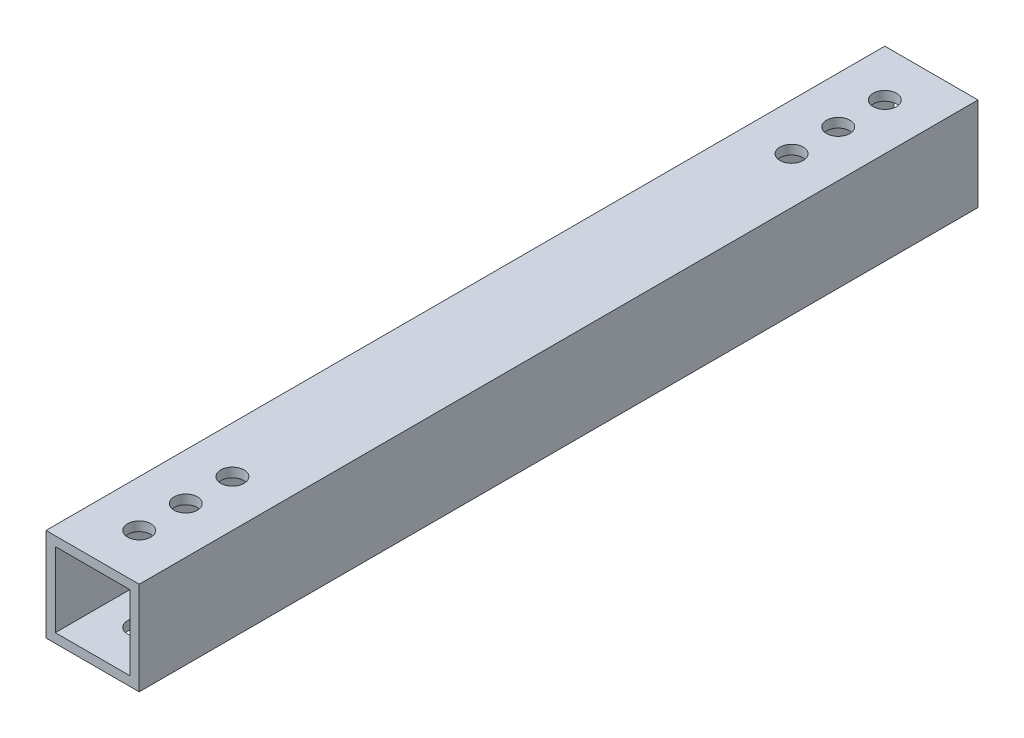
ISO-10303-21;
HEADER;
FILE_DESCRIPTION(('STEP AP214'),'2;1');
FILE_NAME('part.step','',(''),(''),'','','');
FILE_SCHEMA(('AUTOMOTIVE_DESIGN { 1 0 10303 214 1 1 1 1 }'));
ENDSEC;
DATA;
#1=APPLICATION_CONTEXT('core data for automotive mechanical design processes');
#2=APPLICATION_PROTOCOL_DEFINITION('international standard','automotive_design',2000,#1);
#3=PRODUCT_CONTEXT('',#1,'mechanical');
#4=PRODUCT('Part','Part','',(#3));
#5=PRODUCT_RELATED_PRODUCT_CATEGORY('part','',(#4));
#6=PRODUCT_DEFINITION_FORMATION('','',#4);
#7=PRODUCT_DEFINITION_CONTEXT('part definition',#1,'design');
#8=PRODUCT_DEFINITION('design','',#6,#7);
#9=PRODUCT_DEFINITION_SHAPE('','',#8);
#10=(LENGTH_UNIT() NAMED_UNIT(*) SI_UNIT(.MILLI.,.METRE.));
#11=(NAMED_UNIT(*) PLANE_ANGLE_UNIT() SI_UNIT($,.RADIAN.));
#12=(NAMED_UNIT(*) SI_UNIT($,.STERADIAN.) SOLID_ANGLE_UNIT());
#13=UNCERTAINTY_MEASURE_WITH_UNIT(LENGTH_MEASURE(1.E-05),#10,'distance_accuracy_value','');
#14=(GEOMETRIC_REPRESENTATION_CONTEXT(3) GLOBAL_UNCERTAINTY_ASSIGNED_CONTEXT((#13)) GLOBAL_UNIT_ASSIGNED_CONTEXT((#10,
#11,#12)) REPRESENTATION_CONTEXT('',''));
#15=CARTESIAN_POINT('',(0.,0.,0.));
#16=DIRECTION('',(0.,0.,1.));
#17=DIRECTION('',(1.,0.,0.));
#18=AXIS2_PLACEMENT_3D('',#15,#16,#17);
#19=CARTESIAN_POINT('',(0.,0.,228.6));
#20=DIRECTION('',(0.,0.,-1.));
#21=DIRECTION('',(-1.,0.,0.));
#22=AXIS2_PLACEMENT_3D('',#19,#20,#21);
#23=PLANE('',#22);
#24=DIRECTION('',(0.,1.,0.));
#25=VECTOR('',#24,1.);
#26=CARTESIAN_POINT('',(12.7,-12.7,228.6));
#27=LINE('',#26,#25);
#28=CARTESIAN_POINT('',(12.7,-12.7,228.6));
#29=VERTEX_POINT('',#28);
#30=CARTESIAN_POINT('',(12.7,12.7,228.6));
#31=VERTEX_POINT('',#30);
#32=EDGE_CURVE('E138',#29,#31,#27,.T.);
#33=ORIENTED_EDGE('',*,*,#32,.T.);
#34=DIRECTION('',(-1.,0.,0.));
#35=VECTOR('',#34,1.);
#36=CARTESIAN_POINT('',(-12.7,12.7,228.6));
#37=LINE('',#36,#35);
#38=CARTESIAN_POINT('',(-12.7,12.7,228.6));
#39=VERTEX_POINT('',#38);
#40=EDGE_CURVE('E141',#31,#39,#37,.T.);
#41=ORIENTED_EDGE('',*,*,#40,.T.);
#42=DIRECTION('',(0.,-1.,0.));
#43=VECTOR('',#42,1.);
#44=CARTESIAN_POINT('',(-12.7,-12.7,228.6));
#45=LINE('',#44,#43);
#46=CARTESIAN_POINT('',(-12.7,-12.7,228.6));
#47=VERTEX_POINT('',#46);
#48=EDGE_CURVE('E144',#39,#47,#45,.T.);
#49=ORIENTED_EDGE('',*,*,#48,.T.);
#50=DIRECTION('',(1.,0.,0.));
#51=VECTOR('',#50,1.);
#52=CARTESIAN_POINT('',(-12.7,-12.7,228.6));
#53=LINE('',#52,#51);
#54=EDGE_CURVE('E146',#47,#29,#53,.T.);
#55=ORIENTED_EDGE('',*,*,#54,.T.);
#56=EDGE_LOOP('',(#33,#41,#49,#55));
#57=FACE_BOUND('',#56,.T.);
#58=DIRECTION('',(0.,-1.,0.));
#59=VECTOR('',#58,1.);
#60=CARTESIAN_POINT('',(-10.16,-10.16,228.6));
#61=LINE('',#60,#59);
#62=CARTESIAN_POINT('',(-10.16,10.16,228.6));
#63=VERTEX_POINT('',#62);
#64=CARTESIAN_POINT('',(-10.16,-10.16,228.6));
#65=VERTEX_POINT('',#64);
#66=EDGE_CURVE('E100',#63,#65,#61,.T.);
#67=ORIENTED_EDGE('',*,*,#66,.F.);
#68=DIRECTION('',(-1.,0.,0.));
#69=VECTOR('',#68,1.);
#70=CARTESIAN_POINT('',(-10.16,10.16,228.6));
#71=LINE('',#70,#69);
#72=CARTESIAN_POINT('',(10.16,10.16,228.6));
#73=VERTEX_POINT('',#72);
#74=EDGE_CURVE('E122',#73,#63,#71,.T.);
#75=ORIENTED_EDGE('',*,*,#74,.F.);
#76=DIRECTION('',(0.,1.,0.));
#77=VECTOR('',#76,1.);
#78=CARTESIAN_POINT('',(10.16,-10.16,228.6));
#79=LINE('',#78,#77);
#80=CARTESIAN_POINT('',(10.16,-10.16,228.6));
#81=VERTEX_POINT('',#80);
#82=EDGE_CURVE('E120',#81,#73,#79,.T.);
#83=ORIENTED_EDGE('',*,*,#82,.F.);
#84=DIRECTION('',(1.,0.,0.));
#85=VECTOR('',#84,1.);
#86=CARTESIAN_POINT('',(-10.16,-10.16,228.6));
#87=LINE('',#86,#85);
#88=EDGE_CURVE('E108',#65,#81,#87,.T.);
#89=ORIENTED_EDGE('',*,*,#88,.F.);
#90=EDGE_LOOP('',(#67,#75,#83,#89));
#91=FACE_BOUND('',#90,.T.);
#92=ADVANCED_FACE('F33',(#57,#91),#23,.F.);
#93=CARTESIAN_POINT('',(0.,0.,0.));
#94=DIRECTION('',(0.,0.,-1.));
#95=DIRECTION('',(-1.,0.,0.));
#96=AXIS2_PLACEMENT_3D('',#93,#94,#95);
#97=PLANE('',#96);
#98=DIRECTION('',(0.,1.,0.));
#99=VECTOR('',#98,1.);
#100=CARTESIAN_POINT('',(12.7,-12.7,0.));
#101=LINE('',#100,#99);
#102=CARTESIAN_POINT('',(12.7,-12.7,0.));
#103=VERTEX_POINT('',#102);
#104=CARTESIAN_POINT('',(12.7,12.7,0.));
#105=VERTEX_POINT('',#104);
#106=EDGE_CURVE('E116',#103,#105,#101,.T.);
#107=ORIENTED_EDGE('',*,*,#106,.F.);
#108=DIRECTION('',(1.,0.,0.));
#109=VECTOR('',#108,1.);
#110=CARTESIAN_POINT('',(-12.7,-12.7,0.));
#111=LINE('',#110,#109);
#112=CARTESIAN_POINT('',(-12.7,-12.7,0.));
#113=VERTEX_POINT('',#112);
#114=EDGE_CURVE('E142',#113,#103,#111,.T.);
#115=ORIENTED_EDGE('',*,*,#114,.F.);
#116=DIRECTION('',(0.,-1.,0.));
#117=VECTOR('',#116,1.);
#118=CARTESIAN_POINT('',(-12.7,-12.7,0.));
#119=LINE('',#118,#117);
#120=CARTESIAN_POINT('',(-12.7,12.7,0.));
#121=VERTEX_POINT('',#120);
#122=EDGE_CURVE('E153',#121,#113,#119,.T.);
#123=ORIENTED_EDGE('',*,*,#122,.F.);
#124=DIRECTION('',(-1.,0.,0.));
#125=VECTOR('',#124,1.);
#126=CARTESIAN_POINT('',(-12.7,12.7,0.));
#127=LINE('',#126,#125);
#128=EDGE_CURVE('E151',#105,#121,#127,.T.);
#129=ORIENTED_EDGE('',*,*,#128,.F.);
#130=EDGE_LOOP('',(#107,#115,#123,#129));
#131=FACE_BOUND('',#130,.T.);
#132=DIRECTION('',(-1.,0.,0.));
#133=VECTOR('',#132,1.);
#134=CARTESIAN_POINT('',(-10.16,10.16,0.));
#135=LINE('',#134,#133);
#136=CARTESIAN_POINT('',(10.16,10.16,0.));
#137=VERTEX_POINT('',#136);
#138=CARTESIAN_POINT('',(-10.16,10.16,0.));
#139=VERTEX_POINT('',#138);
#140=EDGE_CURVE('E109',#137,#139,#135,.T.);
#141=ORIENTED_EDGE('',*,*,#140,.T.);
#142=DIRECTION('',(0.,-1.,0.));
#143=VECTOR('',#142,1.);
#144=CARTESIAN_POINT('',(-10.16,-10.16,0.));
#145=LINE('',#144,#143);
#146=CARTESIAN_POINT('',(-10.16,-10.16,0.));
#147=VERTEX_POINT('',#146);
#148=EDGE_CURVE('E58',#139,#147,#145,.T.);
#149=ORIENTED_EDGE('',*,*,#148,.T.);
#150=DIRECTION('',(1.,0.,0.));
#151=VECTOR('',#150,1.);
#152=CARTESIAN_POINT('',(-10.16,-10.16,0.));
#153=LINE('',#152,#151);
#154=CARTESIAN_POINT('',(10.16,-10.16,0.));
#155=VERTEX_POINT('',#154);
#156=EDGE_CURVE('E115',#147,#155,#153,.T.);
#157=ORIENTED_EDGE('',*,*,#156,.T.);
#158=DIRECTION('',(0.,1.,0.));
#159=VECTOR('',#158,1.);
#160=CARTESIAN_POINT('',(10.16,-10.16,0.));
#161=LINE('',#160,#159);
#162=EDGE_CURVE('E130',#155,#137,#161,.T.);
#163=ORIENTED_EDGE('',*,*,#162,.T.);
#164=EDGE_LOOP('',(#141,#149,#157,#163));
#165=FACE_BOUND('',#164,.T.);
#166=ADVANCED_FACE('F249',(#131,#165),#97,.T.);
#167=CARTESIAN_POINT('',(12.7,-12.7,228.6));
#168=DIRECTION('',(-1.,0.,0.));
#169=DIRECTION('',(0.,0.,1.));
#170=AXIS2_PLACEMENT_3D('',#167,#168,#169);
#171=PLANE('',#170);
#172=ORIENTED_EDGE('',*,*,#106,.T.);
#173=DIRECTION('',(0.,0.,-1.));
#174=VECTOR('',#173,1.);
#175=CARTESIAN_POINT('',(12.7,12.7,228.6));
#176=LINE('',#175,#174);
#177=EDGE_CURVE('E11',#31,#105,#176,.T.);
#178=ORIENTED_EDGE('',*,*,#177,.F.);
#179=ORIENTED_EDGE('',*,*,#32,.F.);
#180=DIRECTION('',(0.,0.,-1.));
#181=VECTOR('',#180,1.);
#182=CARTESIAN_POINT('',(12.7,-12.7,228.6));
#183=LINE('',#182,#181);
#184=EDGE_CURVE('E148',#29,#103,#183,.T.);
#185=ORIENTED_EDGE('',*,*,#184,.T.);
#186=EDGE_LOOP('',(#172,#178,#179,#185));
#187=FACE_BOUND('',#186,.T.);
#188=ADVANCED_FACE('F35',(#187),#171,.F.);
#189=CARTESIAN_POINT('',(-12.7,12.7,228.6));
#190=DIRECTION('',(0.,-1.,0.));
#191=DIRECTION('',(0.,0.,-1.));
#192=AXIS2_PLACEMENT_3D('',#189,#190,#191);
#193=PLANE('',#192);
#194=CARTESIAN_POINT('',(0.,12.7,215.9));
#195=DIRECTION('',(0.,1.,0.));
#196=DIRECTION('',(0.,0.,-1.));
#197=AXIS2_PLACEMENT_3D('',#194,#195,#196);
#198=CIRCLE('',#197,3.175);
#199=CARTESIAN_POINT('',(0.,12.7,212.725));
#200=VERTEX_POINT('',#199);
#201=EDGE_CURVE('E274',#200,#200,#198,.T.);
#202=ORIENTED_EDGE('',*,*,#201,.F.);
#203=EDGE_LOOP('',(#202));
#204=FACE_BOUND('',#203,.T.);
#205=CARTESIAN_POINT('',(1.79700204165607E-13,12.7,203.2));
#206=DIRECTION('',(0.,1.,0.));
#207=DIRECTION('',(0.,0.,-1.));
#208=AXIS2_PLACEMENT_3D('',#205,#206,#207);
#209=CIRCLE('',#208,3.175);
#210=CARTESIAN_POINT('',(1.79700204165607E-13,12.7,200.025));
#211=VERTEX_POINT('',#210);
#212=EDGE_CURVE('E191',#211,#211,#209,.T.);
#213=ORIENTED_EDGE('',*,*,#212,.F.);
#214=EDGE_LOOP('',(#213));
#215=FACE_BOUND('',#214,.T.);
#216=CARTESIAN_POINT('',(3.57845106896297E-13,12.7,190.5));
#217=DIRECTION('',(0.,1.,0.));
#218=DIRECTION('',(0.,0.,-1.));
#219=AXIS2_PLACEMENT_3D('',#216,#217,#218);
#220=CIRCLE('',#219,3.175);
#221=CARTESIAN_POINT('',(3.57845106896297E-13,12.7,187.325));
#222=VERTEX_POINT('',#221);
#223=EDGE_CURVE('E188',#222,#222,#220,.T.);
#224=ORIENTED_EDGE('',*,*,#223,.F.);
#225=EDGE_LOOP('',(#224));
#226=FACE_BOUND('',#225,.T.);
#227=CARTESIAN_POINT('',(3.57845106896297E-13,12.7,38.1));
#228=DIRECTION('',(0.,1.,0.));
#229=DIRECTION('',(0.,0.,1.));
#230=AXIS2_PLACEMENT_3D('',#227,#228,#229);
#231=CIRCLE('',#230,3.175);
#232=CARTESIAN_POINT('',(3.57845106896297E-13,12.7,41.275));
#233=VERTEX_POINT('',#232);
#234=EDGE_CURVE('E207',#233,#233,#231,.T.);
#235=ORIENTED_EDGE('',*,*,#234,.F.);
#236=EDGE_LOOP('',(#235));
#237=FACE_BOUND('',#236,.T.);
#238=CARTESIAN_POINT('',(1.79700204165607E-13,12.7,25.4));
#239=DIRECTION('',(0.,1.,0.));
#240=DIRECTION('',(0.,0.,1.));
#241=AXIS2_PLACEMENT_3D('',#238,#239,#240);
#242=CIRCLE('',#241,3.175);
#243=CARTESIAN_POINT('',(1.79700204165607E-13,12.7,28.575));
#244=VERTEX_POINT('',#243);
#245=EDGE_CURVE('E214',#244,#244,#242,.T.);
#246=ORIENTED_EDGE('',*,*,#245,.F.);
#247=EDGE_LOOP('',(#246));
#248=FACE_BOUND('',#247,.T.);
#249=CARTESIAN_POINT('',(0.,12.7,12.7));
#250=DIRECTION('',(0.,1.,0.));
#251=DIRECTION('',(0.,0.,1.));
#252=AXIS2_PLACEMENT_3D('',#249,#250,#251);
#253=CIRCLE('',#252,3.175);
#254=CARTESIAN_POINT('',(0.,12.7,15.875));
#255=VERTEX_POINT('',#254);
#256=EDGE_CURVE('E221',#255,#255,#253,.T.);
#257=ORIENTED_EDGE('',*,*,#256,.F.);
#258=EDGE_LOOP('',(#257));
#259=FACE_BOUND('',#258,.T.);
#260=ORIENTED_EDGE('',*,*,#128,.T.);
#261=DIRECTION('',(0.,0.,-1.));
#262=VECTOR('',#261,1.);
#263=CARTESIAN_POINT('',(-12.7,12.7,228.6));
#264=LINE('',#263,#262);
#265=EDGE_CURVE('E42',#39,#121,#264,.T.);
#266=ORIENTED_EDGE('',*,*,#265,.F.);
#267=ORIENTED_EDGE('',*,*,#40,.F.);
#268=ORIENTED_EDGE('',*,*,#177,.T.);
#269=EDGE_LOOP('',(#260,#266,#267,#268));
#270=FACE_BOUND('',#269,.T.);
#271=ADVANCED_FACE('F262',(#204,#215,#226,#237,#248,#259,#270),#193,.F.);
#272=CARTESIAN_POINT('',(-12.7,-12.7,228.6));
#273=DIRECTION('',(1.,0.,0.));
#274=DIRECTION('',(0.,0.,-1.));
#275=AXIS2_PLACEMENT_3D('',#272,#273,#274);
#276=PLANE('',#275);
#277=ORIENTED_EDGE('',*,*,#122,.T.);
#278=DIRECTION('',(0.,0.,-1.));
#279=VECTOR('',#278,1.);
#280=CARTESIAN_POINT('',(-12.7,-12.7,228.6));
#281=LINE('',#280,#279);
#282=EDGE_CURVE('E158',#47,#113,#281,.T.);
#283=ORIENTED_EDGE('',*,*,#282,.F.);
#284=ORIENTED_EDGE('',*,*,#48,.F.);
#285=ORIENTED_EDGE('',*,*,#265,.T.);
#286=EDGE_LOOP('',(#277,#283,#284,#285));
#287=FACE_BOUND('',#286,.T.);
#288=ADVANCED_FACE('F259',(#287),#276,.F.);
#289=CARTESIAN_POINT('',(-12.7,-12.7,228.6));
#290=DIRECTION('',(0.,1.,0.));
#291=DIRECTION('',(0.,0.,1.));
#292=AXIS2_PLACEMENT_3D('',#289,#290,#291);
#293=PLANE('',#292);
#294=CARTESIAN_POINT('',(0.,-12.7,215.9));
#295=DIRECTION('',(0.,1.,0.));
#296=DIRECTION('',(0.,0.,-1.));
#297=AXIS2_PLACEMENT_3D('',#294,#295,#296);
#298=CIRCLE('',#297,3.175);
#299=CARTESIAN_POINT('',(0.,-12.7,212.725));
#300=VERTEX_POINT('',#299);
#301=EDGE_CURVE('E341',#300,#300,#298,.T.);
#302=ORIENTED_EDGE('',*,*,#301,.T.);
#303=EDGE_LOOP('',(#302));
#304=FACE_BOUND('',#303,.T.);
#305=CARTESIAN_POINT('',(1.79700204165607E-13,-12.7,203.2));
#306=DIRECTION('',(0.,1.,0.));
#307=DIRECTION('',(0.,0.,-1.));
#308=AXIS2_PLACEMENT_3D('',#305,#306,#307);
#309=CIRCLE('',#308,3.175);
#310=CARTESIAN_POINT('',(1.79700204165607E-13,-12.7,200.025));
#311=VERTEX_POINT('',#310);
#312=EDGE_CURVE('E184',#311,#311,#309,.T.);
#313=ORIENTED_EDGE('',*,*,#312,.T.);
#314=EDGE_LOOP('',(#313));
#315=FACE_BOUND('',#314,.T.);
#316=CARTESIAN_POINT('',(3.57845106896297E-13,-12.7,190.5));
#317=DIRECTION('',(0.,1.,0.));
#318=DIRECTION('',(0.,0.,-1.));
#319=AXIS2_PLACEMENT_3D('',#316,#317,#318);
#320=CIRCLE('',#319,3.175);
#321=CARTESIAN_POINT('',(3.57845106896297E-13,-12.7,187.325));
#322=VERTEX_POINT('',#321);
#323=EDGE_CURVE('E180',#322,#322,#320,.T.);
#324=ORIENTED_EDGE('',*,*,#323,.T.);
#325=EDGE_LOOP('',(#324));
#326=FACE_BOUND('',#325,.T.);
#327=CARTESIAN_POINT('',(3.57845106896297E-13,-12.7,38.1));
#328=DIRECTION('',(0.,1.,0.));
#329=DIRECTION('',(0.,0.,1.));
#330=AXIS2_PLACEMENT_3D('',#327,#328,#329);
#331=CIRCLE('',#330,3.175);
#332=CARTESIAN_POINT('',(3.57845106896297E-13,-12.7,41.275));
#333=VERTEX_POINT('',#332);
#334=EDGE_CURVE('E176',#333,#333,#331,.T.);
#335=ORIENTED_EDGE('',*,*,#334,.T.);
#336=EDGE_LOOP('',(#335));
#337=FACE_BOUND('',#336,.T.);
#338=CARTESIAN_POINT('',(1.79700204165607E-13,-12.7,25.4));
#339=DIRECTION('',(0.,1.,0.));
#340=DIRECTION('',(0.,0.,1.));
#341=AXIS2_PLACEMENT_3D('',#338,#339,#340);
#342=CIRCLE('',#341,3.175);
#343=CARTESIAN_POINT('',(1.79700204165607E-13,-12.7,28.575));
#344=VERTEX_POINT('',#343);
#345=EDGE_CURVE('E171',#344,#344,#342,.T.);
#346=ORIENTED_EDGE('',*,*,#345,.T.);
#347=EDGE_LOOP('',(#346));
#348=FACE_BOUND('',#347,.T.);
#349=CARTESIAN_POINT('',(0.,-12.7,12.7));
#350=DIRECTION('',(0.,1.,0.));
#351=DIRECTION('',(0.,0.,1.));
#352=AXIS2_PLACEMENT_3D('',#349,#350,#351);
#353=CIRCLE('',#352,3.175);
#354=CARTESIAN_POINT('',(0.,-12.7,15.875));
#355=VERTEX_POINT('',#354);
#356=EDGE_CURVE('E166',#355,#355,#353,.T.);
#357=ORIENTED_EDGE('',*,*,#356,.T.);
#358=EDGE_LOOP('',(#357));
#359=FACE_BOUND('',#358,.T.);
#360=ORIENTED_EDGE('',*,*,#114,.T.);
#361=ORIENTED_EDGE('',*,*,#184,.F.);
#362=ORIENTED_EDGE('',*,*,#54,.F.);
#363=ORIENTED_EDGE('',*,*,#282,.T.);
#364=EDGE_LOOP('',(#360,#361,#362,#363));
#365=FACE_BOUND('',#364,.T.);
#366=ADVANCED_FACE('F244',(#304,#315,#326,#337,#348,#359,#365),#293,.F.);
#367=CARTESIAN_POINT('',(-10.16,-10.16,228.6));
#368=DIRECTION('',(1.,0.,0.));
#369=DIRECTION('',(0.,0.,-1.));
#370=AXIS2_PLACEMENT_3D('',#367,#368,#369);
#371=PLANE('',#370);
#372=ORIENTED_EDGE('',*,*,#148,.F.);
#373=DIRECTION('',(0.,0.,-1.));
#374=VECTOR('',#373,1.);
#375=CARTESIAN_POINT('',(-10.16,10.16,228.6));
#376=LINE('',#375,#374);
#377=EDGE_CURVE('E104',#63,#139,#376,.T.);
#378=ORIENTED_EDGE('',*,*,#377,.F.);
#379=ORIENTED_EDGE('',*,*,#66,.T.);
#380=DIRECTION('',(0.,0.,-1.));
#381=VECTOR('',#380,1.);
#382=CARTESIAN_POINT('',(-10.16,-10.16,228.6));
#383=LINE('',#382,#381);
#384=EDGE_CURVE('E103',#65,#147,#383,.T.);
#385=ORIENTED_EDGE('',*,*,#384,.T.);
#386=EDGE_LOOP('',(#372,#378,#379,#385));
#387=FACE_BOUND('',#386,.T.);
#388=ADVANCED_FACE('F102',(#387),#371,.T.);
#389=CARTESIAN_POINT('',(-10.16,-10.16,228.6));
#390=DIRECTION('',(0.,1.,0.));
#391=DIRECTION('',(0.,0.,1.));
#392=AXIS2_PLACEMENT_3D('',#389,#390,#391);
#393=PLANE('',#392);
#394=CARTESIAN_POINT('',(0.,-10.16,215.9));
#395=DIRECTION('',(0.,1.,0.));
#396=DIRECTION('',(0.,0.,1.));
#397=AXIS2_PLACEMENT_3D('',#394,#395,#396);
#398=CIRCLE('',#397,3.175);
#399=CARTESIAN_POINT('',(0.,-10.16,219.075));
#400=VERTEX_POINT('',#399);
#401=EDGE_CURVE('E196',#400,#400,#398,.T.);
#402=ORIENTED_EDGE('',*,*,#401,.F.);
#403=EDGE_LOOP('',(#402));
#404=FACE_BOUND('',#403,.T.);
#405=CARTESIAN_POINT('',(1.79700204165607E-13,-10.16,203.2));
#406=DIRECTION('',(0.,1.,0.));
#407=DIRECTION('',(0.,0.,1.));
#408=AXIS2_PLACEMENT_3D('',#405,#406,#407);
#409=CIRCLE('',#408,3.175);
#410=CARTESIAN_POINT('',(1.79700204165607E-13,-10.16,206.375));
#411=VERTEX_POINT('',#410);
#412=EDGE_CURVE('E183',#411,#411,#409,.T.);
#413=ORIENTED_EDGE('',*,*,#412,.F.);
#414=EDGE_LOOP('',(#413));
#415=FACE_BOUND('',#414,.T.);
#416=CARTESIAN_POINT('',(3.57845106896297E-13,-10.16,190.5));
#417=DIRECTION('',(0.,1.,0.));
#418=DIRECTION('',(0.,0.,1.));
#419=AXIS2_PLACEMENT_3D('',#416,#417,#418);
#420=CIRCLE('',#419,3.175);
#421=CARTESIAN_POINT('',(3.57845106896297E-13,-10.16,193.675));
#422=VERTEX_POINT('',#421);
#423=EDGE_CURVE('E179',#422,#422,#420,.T.);
#424=ORIENTED_EDGE('',*,*,#423,.F.);
#425=EDGE_LOOP('',(#424));
#426=FACE_BOUND('',#425,.T.);
#427=CARTESIAN_POINT('',(3.57845106896297E-13,-10.16,38.1));
#428=DIRECTION('',(0.,1.,0.));
#429=DIRECTION('',(0.,0.,1.));
#430=AXIS2_PLACEMENT_3D('',#427,#428,#429);
#431=CIRCLE('',#430,3.175);
#432=CARTESIAN_POINT('',(3.57845106896297E-13,-10.16,41.275));
#433=VERTEX_POINT('',#432);
#434=EDGE_CURVE('E175',#433,#433,#431,.T.);
#435=ORIENTED_EDGE('',*,*,#434,.F.);
#436=EDGE_LOOP('',(#435));
#437=FACE_BOUND('',#436,.T.);
#438=CARTESIAN_POINT('',(1.79700204165607E-13,-10.16,25.4));
#439=DIRECTION('',(0.,1.,0.));
#440=DIRECTION('',(0.,0.,1.));
#441=AXIS2_PLACEMENT_3D('',#438,#439,#440);
#442=CIRCLE('',#441,3.175);
#443=CARTESIAN_POINT('',(1.79700204165607E-13,-10.16,28.575));
#444=VERTEX_POINT('',#443);
#445=EDGE_CURVE('E170',#444,#444,#442,.T.);
#446=ORIENTED_EDGE('',*,*,#445,.F.);
#447=EDGE_LOOP('',(#446));
#448=FACE_BOUND('',#447,.T.);
#449=CARTESIAN_POINT('',(0.,-10.16,12.7));
#450=DIRECTION('',(0.,1.,0.));
#451=DIRECTION('',(0.,0.,1.));
#452=AXIS2_PLACEMENT_3D('',#449,#450,#451);
#453=CIRCLE('',#452,3.175);
#454=CARTESIAN_POINT('',(0.,-10.16,15.875));
#455=VERTEX_POINT('',#454);
#456=EDGE_CURVE('E128',#455,#455,#453,.T.);
#457=ORIENTED_EDGE('',*,*,#456,.F.);
#458=EDGE_LOOP('',(#457));
#459=FACE_BOUND('',#458,.T.);
#460=ORIENTED_EDGE('',*,*,#156,.F.);
#461=ORIENTED_EDGE('',*,*,#384,.F.);
#462=ORIENTED_EDGE('',*,*,#88,.T.);
#463=DIRECTION('',(0.,0.,-1.));
#464=VECTOR('',#463,1.);
#465=CARTESIAN_POINT('',(10.16,-10.16,228.6));
#466=LINE('',#465,#464);
#467=EDGE_CURVE('E117',#81,#155,#466,.T.);
#468=ORIENTED_EDGE('',*,*,#467,.T.);
#469=EDGE_LOOP('',(#460,#461,#462,#468));
#470=FACE_BOUND('',#469,.T.);
#471=ADVANCED_FACE('F112',(#404,#415,#426,#437,#448,#459,#470),#393,.T.);
#472=CARTESIAN_POINT('',(10.16,-10.16,228.6));
#473=DIRECTION('',(-1.,0.,0.));
#474=DIRECTION('',(0.,0.,1.));
#475=AXIS2_PLACEMENT_3D('',#472,#473,#474);
#476=PLANE('',#475);
#477=ORIENTED_EDGE('',*,*,#162,.F.);
#478=ORIENTED_EDGE('',*,*,#467,.F.);
#479=ORIENTED_EDGE('',*,*,#82,.T.);
#480=DIRECTION('',(0.,0.,-1.));
#481=VECTOR('',#480,1.);
#482=CARTESIAN_POINT('',(10.16,10.16,228.6));
#483=LINE('',#482,#481);
#484=EDGE_CURVE('E50',#73,#137,#483,.T.);
#485=ORIENTED_EDGE('',*,*,#484,.T.);
#486=EDGE_LOOP('',(#477,#478,#479,#485));
#487=FACE_BOUND('',#486,.T.);
#488=ADVANCED_FACE('F232',(#487),#476,.T.);
#489=CARTESIAN_POINT('',(-10.16,10.16,228.6));
#490=DIRECTION('',(0.,-1.,0.));
#491=DIRECTION('',(1.,0.,0.));
#492=AXIS2_PLACEMENT_3D('',#489,#490,#491);
#493=PLANE('',#492);
#494=CARTESIAN_POINT('',(0.,10.16,215.9));
#495=DIRECTION('',(0.,-1.,0.));
#496=DIRECTION('',(1.,0.,0.));
#497=AXIS2_PLACEMENT_3D('',#494,#495,#496);
#498=CIRCLE('',#497,3.175);
#499=CARTESIAN_POINT('',(3.175,10.16,215.9));
#500=VERTEX_POINT('',#499);
#501=EDGE_CURVE('E37',#500,#500,#498,.T.);
#502=ORIENTED_EDGE('',*,*,#501,.F.);
#503=EDGE_LOOP('',(#502));
#504=FACE_BOUND('',#503,.T.);
#505=CARTESIAN_POINT('',(1.79700204165607E-13,10.16,203.2));
#506=DIRECTION('',(0.,-1.,0.));
#507=DIRECTION('',(1.,0.,0.));
#508=AXIS2_PLACEMENT_3D('',#505,#506,#507);
#509=CIRCLE('',#508,3.175);
#510=CARTESIAN_POINT('',(3.17500000000018,10.16,203.2));
#511=VERTEX_POINT('',#510);
#512=EDGE_CURVE('E181',#511,#511,#509,.T.);
#513=ORIENTED_EDGE('',*,*,#512,.F.);
#514=EDGE_LOOP('',(#513));
#515=FACE_BOUND('',#514,.T.);
#516=CARTESIAN_POINT('',(3.57845106896297E-13,10.16,190.5));
#517=DIRECTION('',(0.,-1.,0.));
#518=DIRECTION('',(1.,0.,0.));
#519=AXIS2_PLACEMENT_3D('',#516,#517,#518);
#520=CIRCLE('',#519,3.175);
#521=CARTESIAN_POINT('',(3.17500000000036,10.16,190.5));
#522=VERTEX_POINT('',#521);
#523=EDGE_CURVE('E177',#522,#522,#520,.T.);
#524=ORIENTED_EDGE('',*,*,#523,.F.);
#525=EDGE_LOOP('',(#524));
#526=FACE_BOUND('',#525,.T.);
#527=CARTESIAN_POINT('',(3.57845106896297E-13,10.16,38.1));
#528=DIRECTION('',(0.,-1.,0.));
#529=DIRECTION('',(1.,0.,0.));
#530=AXIS2_PLACEMENT_3D('',#527,#528,#529);
#531=CIRCLE('',#530,3.175);
#532=CARTESIAN_POINT('',(3.17500000000036,10.16,38.1));
#533=VERTEX_POINT('',#532);
#534=EDGE_CURVE('E172',#533,#533,#531,.T.);
#535=ORIENTED_EDGE('',*,*,#534,.F.);
#536=EDGE_LOOP('',(#535));
#537=FACE_BOUND('',#536,.T.);
#538=CARTESIAN_POINT('',(1.79700204165607E-13,10.16,25.4));
#539=DIRECTION('',(0.,-1.,0.));
#540=DIRECTION('',(1.,0.,0.));
#541=AXIS2_PLACEMENT_3D('',#538,#539,#540);
#542=CIRCLE('',#541,3.175);
#543=CARTESIAN_POINT('',(3.17500000000018,10.16,25.4));
#544=VERTEX_POINT('',#543);
#545=EDGE_CURVE('E167',#544,#544,#542,.T.);
#546=ORIENTED_EDGE('',*,*,#545,.F.);
#547=EDGE_LOOP('',(#546));
#548=FACE_BOUND('',#547,.T.);
#549=CARTESIAN_POINT('',(0.,10.16,12.7));
#550=DIRECTION('',(0.,-1.,0.));
#551=DIRECTION('',(1.,0.,0.));
#552=AXIS2_PLACEMENT_3D('',#549,#550,#551);
#553=CIRCLE('',#552,3.175);
#554=CARTESIAN_POINT('',(3.175,10.16,12.7));
#555=VERTEX_POINT('',#554);
#556=EDGE_CURVE('E163',#555,#555,#553,.T.);
#557=ORIENTED_EDGE('',*,*,#556,.F.);
#558=EDGE_LOOP('',(#557));
#559=FACE_BOUND('',#558,.T.);
#560=ORIENTED_EDGE('',*,*,#140,.F.);
#561=ORIENTED_EDGE('',*,*,#484,.F.);
#562=ORIENTED_EDGE('',*,*,#74,.T.);
#563=ORIENTED_EDGE('',*,*,#377,.T.);
#564=EDGE_LOOP('',(#560,#561,#562,#563));
#565=FACE_BOUND('',#564,.T.);
#566=ADVANCED_FACE('F240',(#504,#515,#526,#537,#548,#559,#565),#493,.T.);
#567=CARTESIAN_POINT('',(0.,-12.7,12.7));
#568=DIRECTION('',(0.,1.,0.));
#569=DIRECTION('',(0.,0.,1.));
#570=AXIS2_PLACEMENT_3D('',#567,#568,#569);
#571=CYLINDRICAL_SURFACE('',#570,3.175);
#572=ORIENTED_EDGE('',*,*,#556,.T.);
#573=EDGE_LOOP('',(#572));
#574=FACE_BOUND('',#573,.T.);
#575=ORIENTED_EDGE('',*,*,#256,.T.);
#576=EDGE_LOOP('',(#575));
#577=FACE_BOUND('',#576,.T.);
#578=ADVANCED_FACE('F298',(#574,#577),#571,.F.);
#579=ORIENTED_EDGE('',*,*,#456,.T.);
#580=EDGE_LOOP('',(#579));
#581=FACE_BOUND('',#580,.T.);
#582=ORIENTED_EDGE('',*,*,#356,.F.);
#583=EDGE_LOOP('',(#582));
#584=FACE_BOUND('',#583,.T.);
#585=ADVANCED_FACE('F228',(#581,#584),#571,.F.);
#586=CARTESIAN_POINT('',(1.79700204165607E-13,-12.7,25.4));
#587=DIRECTION('',(0.,1.,0.));
#588=DIRECTION('',(0.,0.,1.));
#589=AXIS2_PLACEMENT_3D('',#586,#587,#588);
#590=CYLINDRICAL_SURFACE('',#589,3.175);
#591=ORIENTED_EDGE('',*,*,#545,.T.);
#592=EDGE_LOOP('',(#591));
#593=FACE_BOUND('',#592,.T.);
#594=ORIENTED_EDGE('',*,*,#245,.T.);
#595=EDGE_LOOP('',(#594));
#596=FACE_BOUND('',#595,.T.);
#597=ADVANCED_FACE('F310',(#593,#596),#590,.F.);
#598=ORIENTED_EDGE('',*,*,#445,.T.);
#599=EDGE_LOOP('',(#598));
#600=FACE_BOUND('',#599,.T.);
#601=ORIENTED_EDGE('',*,*,#345,.F.);
#602=EDGE_LOOP('',(#601));
#603=FACE_BOUND('',#602,.T.);
#604=ADVANCED_FACE('F313',(#600,#603),#590,.F.);
#605=CARTESIAN_POINT('',(3.57845106896297E-13,-12.7,38.1));
#606=DIRECTION('',(0.,1.,0.));
#607=DIRECTION('',(0.,0.,1.));
#608=AXIS2_PLACEMENT_3D('',#605,#606,#607);
#609=CYLINDRICAL_SURFACE('',#608,3.175);
#610=ORIENTED_EDGE('',*,*,#534,.T.);
#611=EDGE_LOOP('',(#610));
#612=FACE_BOUND('',#611,.T.);
#613=ORIENTED_EDGE('',*,*,#234,.T.);
#614=EDGE_LOOP('',(#613));
#615=FACE_BOUND('',#614,.T.);
#616=ADVANCED_FACE('F315',(#612,#615),#609,.F.);
#617=ORIENTED_EDGE('',*,*,#434,.T.);
#618=EDGE_LOOP('',(#617));
#619=FACE_BOUND('',#618,.T.);
#620=ORIENTED_EDGE('',*,*,#334,.F.);
#621=EDGE_LOOP('',(#620));
#622=FACE_BOUND('',#621,.T.);
#623=ADVANCED_FACE('F318',(#619,#622),#609,.F.);
#624=CARTESIAN_POINT('',(3.57845106896297E-13,-12.7,190.5));
#625=DIRECTION('',(0.,1.,0.));
#626=DIRECTION('',(0.,0.,1.));
#627=AXIS2_PLACEMENT_3D('',#624,#625,#626);
#628=CYLINDRICAL_SURFACE('',#627,3.175);
#629=ORIENTED_EDGE('',*,*,#523,.T.);
#630=EDGE_LOOP('',(#629));
#631=FACE_BOUND('',#630,.T.);
#632=ORIENTED_EDGE('',*,*,#223,.T.);
#633=EDGE_LOOP('',(#632));
#634=FACE_BOUND('',#633,.T.);
#635=ADVANCED_FACE('F320',(#631,#634),#628,.F.);
#636=ORIENTED_EDGE('',*,*,#423,.T.);
#637=EDGE_LOOP('',(#636));
#638=FACE_BOUND('',#637,.T.);
#639=ORIENTED_EDGE('',*,*,#323,.F.);
#640=EDGE_LOOP('',(#639));
#641=FACE_BOUND('',#640,.T.);
#642=ADVANCED_FACE('F323',(#638,#641),#628,.F.);
#643=CARTESIAN_POINT('',(1.79700204165607E-13,-12.7,203.2));
#644=DIRECTION('',(0.,1.,0.));
#645=DIRECTION('',(0.,0.,1.));
#646=AXIS2_PLACEMENT_3D('',#643,#644,#645);
#647=CYLINDRICAL_SURFACE('',#646,3.175);
#648=ORIENTED_EDGE('',*,*,#512,.T.);
#649=EDGE_LOOP('',(#648));
#650=FACE_BOUND('',#649,.T.);
#651=ORIENTED_EDGE('',*,*,#212,.T.);
#652=EDGE_LOOP('',(#651));
#653=FACE_BOUND('',#652,.T.);
#654=ADVANCED_FACE('F325',(#650,#653),#647,.F.);
#655=ORIENTED_EDGE('',*,*,#412,.T.);
#656=EDGE_LOOP('',(#655));
#657=FACE_BOUND('',#656,.T.);
#658=ORIENTED_EDGE('',*,*,#312,.F.);
#659=EDGE_LOOP('',(#658));
#660=FACE_BOUND('',#659,.T.);
#661=ADVANCED_FACE('F328',(#657,#660),#647,.F.);
#662=CARTESIAN_POINT('',(0.,-12.7,215.9));
#663=DIRECTION('',(0.,1.,0.));
#664=DIRECTION('',(0.,0.,1.));
#665=AXIS2_PLACEMENT_3D('',#662,#663,#664);
#666=CYLINDRICAL_SURFACE('',#665,3.175);
#667=ORIENTED_EDGE('',*,*,#501,.T.);
#668=EDGE_LOOP('',(#667));
#669=FACE_BOUND('',#668,.T.);
#670=ORIENTED_EDGE('',*,*,#201,.T.);
#671=EDGE_LOOP('',(#670));
#672=FACE_BOUND('',#671,.T.);
#673=ADVANCED_FACE('F329',(#669,#672),#666,.F.);
#674=ORIENTED_EDGE('',*,*,#401,.T.);
#675=EDGE_LOOP('',(#674));
#676=FACE_BOUND('',#675,.T.);
#677=ORIENTED_EDGE('',*,*,#301,.F.);
#678=EDGE_LOOP('',(#677));
#679=FACE_BOUND('',#678,.T.);
#680=ADVANCED_FACE('F331',(#676,#679),#666,.F.);
#681=CLOSED_SHELL('',(#92,#166,#188,#271,#288,#366,#388,#471,#488,#566,#578,#585,#597,#604,#616,
#623,#635,#642,#654,#661,#673,#680));
#682=MANIFOLD_SOLID_BREP('B2',#681);
#683=ADVANCED_BREP_SHAPE_REPRESENTATION('',(#18,#682),#14);
#684=SHAPE_DEFINITION_REPRESENTATION(#9,#683);
ENDSEC;
END-ISO-10303-21;
